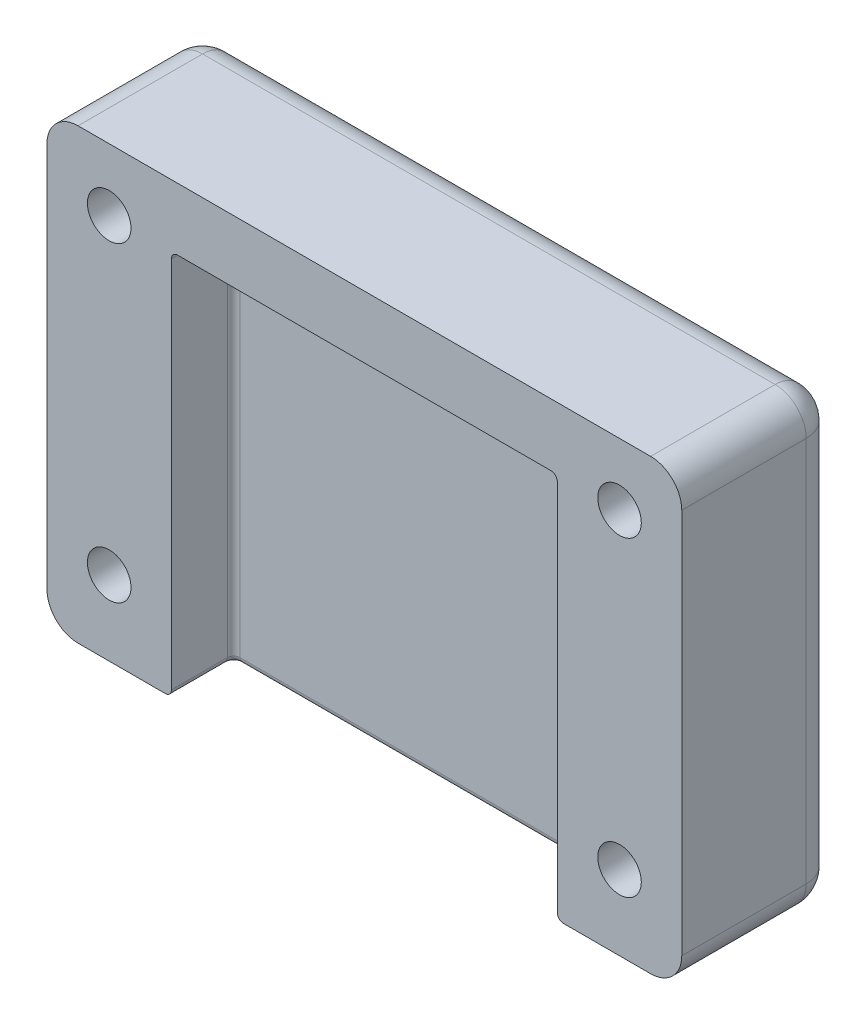
ISO-10303-21;
HEADER;
FILE_DESCRIPTION(('STEP AP214'),'2;1');
FILE_NAME('part.step','',(''),(''),'','','');
FILE_SCHEMA(('AUTOMOTIVE_DESIGN { 1 0 10303 214 1 1 1 1 }'));
ENDSEC;
DATA;
#1=APPLICATION_CONTEXT('core data for automotive mechanical design processes');
#2=APPLICATION_PROTOCOL_DEFINITION('international standard','automotive_design',2000,#1);
#3=PRODUCT_CONTEXT('',#1,'mechanical');
#4=PRODUCT('Part','Part','',(#3));
#5=PRODUCT_RELATED_PRODUCT_CATEGORY('part','',(#4));
#6=PRODUCT_DEFINITION_FORMATION('','',#4);
#7=PRODUCT_DEFINITION_CONTEXT('part definition',#1,'design');
#8=PRODUCT_DEFINITION('design','',#6,#7);
#9=PRODUCT_DEFINITION_SHAPE('','',#8);
#10=(LENGTH_UNIT() NAMED_UNIT(*) SI_UNIT(.MILLI.,.METRE.));
#11=(NAMED_UNIT(*) PLANE_ANGLE_UNIT() SI_UNIT($,.RADIAN.));
#12=(NAMED_UNIT(*) SI_UNIT($,.STERADIAN.) SOLID_ANGLE_UNIT());
#13=UNCERTAINTY_MEASURE_WITH_UNIT(LENGTH_MEASURE(1.E-05),#10,'distance_accuracy_value','');
#14=(GEOMETRIC_REPRESENTATION_CONTEXT(3) GLOBAL_UNCERTAINTY_ASSIGNED_CONTEXT((#13)) GLOBAL_UNIT_ASSIGNED_CONTEXT((#10,
#11,#12)) REPRESENTATION_CONTEXT('',''));
#15=CARTESIAN_POINT('',(0.,0.,0.));
#16=DIRECTION('',(0.,0.,1.));
#17=DIRECTION('',(1.,0.,0.));
#18=AXIS2_PLACEMENT_3D('',#15,#16,#17);
#19=CARTESIAN_POINT('',(0.,36.,12.5));
#20=DIRECTION('',(1.,0.,0.));
#21=DIRECTION('',(0.,0.,-1.));
#22=AXIS2_PLACEMENT_3D('',#19,#20,#21);
#23=PLANE('',#22);
#24=DIRECTION('',(0.,-1.,0.));
#25=VECTOR('',#24,1.);
#26=CARTESIAN_POINT('',(0.,36.,12.5));
#27=LINE('',#26,#25);
#28=CARTESIAN_POINT('',(0.,33.5,12.5));
#29=VERTEX_POINT('',#28);
#30=CARTESIAN_POINT('',(0.,2.5,12.5));
#31=VERTEX_POINT('',#30);
#32=EDGE_CURVE('E525',#29,#31,#27,.T.);
#33=ORIENTED_EDGE('',*,*,#32,.F.);
#34=DIRECTION('',(0.,0.,-1.));
#35=VECTOR('',#34,1.);
#36=CARTESIAN_POINT('',(0.,33.5,12.5));
#37=LINE('',#36,#35);
#38=CARTESIAN_POINT('',(0.,33.5,2.5));
#39=VERTEX_POINT('',#38);
#40=EDGE_CURVE('E343',#29,#39,#37,.T.);
#41=ORIENTED_EDGE('',*,*,#40,.T.);
#42=DIRECTION('',(0.,-1.,0.));
#43=VECTOR('',#42,1.);
#44=CARTESIAN_POINT('',(0.,36.,2.5));
#45=LINE('',#44,#43);
#46=CARTESIAN_POINT('',(0.,2.5,2.5));
#47=VERTEX_POINT('',#46);
#48=EDGE_CURVE('E340',#39,#47,#45,.T.);
#49=ORIENTED_EDGE('',*,*,#48,.T.);
#50=DIRECTION('',(0.,0.,-1.));
#51=VECTOR('',#50,1.);
#52=CARTESIAN_POINT('',(0.,2.5,12.5));
#53=LINE('',#52,#51);
#54=EDGE_CURVE('E337',#47,#31,#53,.F.);
#55=ORIENTED_EDGE('',*,*,#54,.T.);
#56=EDGE_LOOP('',(#33,#41,#49,#55));
#57=FACE_BOUND('',#56,.T.);
#58=ADVANCED_FACE('F40',(#57),#23,.F.);
#59=CARTESIAN_POINT('',(0.,0.,12.5));
#60=DIRECTION('',(0.,1.,0.));
#61=DIRECTION('',(0.,0.,1.));
#62=AXIS2_PLACEMENT_3D('',#59,#60,#61);
#63=PLANE('',#62);
#64=DIRECTION('',(1.,0.,0.));
#65=VECTOR('',#64,1.);
#66=CARTESIAN_POINT('',(0.,0.,2.5));
#67=LINE('',#66,#65);
#68=CARTESIAN_POINT('',(2.5,0.,2.5));
#69=VERTEX_POINT('',#68);
#70=CARTESIAN_POINT('',(48.5,0.,2.5));
#71=VERTEX_POINT('',#70);
#72=EDGE_CURVE('E318',#69,#71,#67,.T.);
#73=ORIENTED_EDGE('',*,*,#72,.T.);
#74=DIRECTION('',(0.,0.,-1.));
#75=VECTOR('',#74,1.);
#76=CARTESIAN_POINT('',(48.5,0.,12.5));
#77=LINE('',#76,#75);
#78=CARTESIAN_POINT('',(48.5,0.,12.5));
#79=VERTEX_POINT('',#78);
#80=EDGE_CURVE('E321',#71,#79,#77,.F.);
#81=ORIENTED_EDGE('',*,*,#80,.T.);
#82=DIRECTION('',(1.,0.,0.));
#83=VECTOR('',#82,1.);
#84=CARTESIAN_POINT('',(0.,0.,12.5));
#85=LINE('',#84,#83);
#86=CARTESIAN_POINT('',(41.5,0.,12.5));
#87=VERTEX_POINT('',#86);
#88=EDGE_CURVE('E197',#87,#79,#85,.T.);
#89=ORIENTED_EDGE('',*,*,#88,.F.);
#90=DIRECTION('',(0.,0.,1.));
#91=VECTOR('',#90,1.);
#92=CARTESIAN_POINT('',(41.5,0.,12.5));
#93=LINE('',#92,#91);
#94=CARTESIAN_POINT('',(41.5,0.,8.));
#95=VERTEX_POINT('',#94);
#96=EDGE_CURVE('E462',#87,#95,#93,.F.);
#97=ORIENTED_EDGE('',*,*,#96,.T.);
#98=CARTESIAN_POINT('',(40.5,0.,8.));
#99=DIRECTION('',(0.,1.,0.));
#100=DIRECTION('',(0.,0.,1.));
#101=AXIS2_PLACEMENT_3D('',#98,#99,#100);
#102=CIRCLE('',#101,1.);
#103=CARTESIAN_POINT('',(40.5,0.,7.));
#104=VERTEX_POINT('',#103);
#105=EDGE_CURVE('E455',#104,#95,#102,.F.);
#106=ORIENTED_EDGE('',*,*,#105,.F.);
#107=DIRECTION('',(1.,0.,0.));
#108=VECTOR('',#107,1.);
#109=CARTESIAN_POINT('',(0.,0.,7.));
#110=LINE('',#109,#108);
#111=CARTESIAN_POINT('',(10.5,0.,7.));
#112=VERTEX_POINT('',#111);
#113=EDGE_CURVE('E220',#104,#112,#110,.F.);
#114=ORIENTED_EDGE('',*,*,#113,.T.);
#115=CARTESIAN_POINT('',(10.5,0.,8.));
#116=DIRECTION('',(0.,1.,0.));
#117=DIRECTION('',(0.,0.,1.));
#118=AXIS2_PLACEMENT_3D('',#115,#116,#117);
#119=CIRCLE('',#118,1.);
#120=CARTESIAN_POINT('',(9.49999999999999,0.,8.));
#121=VERTEX_POINT('',#120);
#122=EDGE_CURVE('E213',#121,#112,#119,.F.);
#123=ORIENTED_EDGE('',*,*,#122,.F.);
#124=DIRECTION('',(0.,0.,1.));
#125=VECTOR('',#124,1.);
#126=CARTESIAN_POINT('',(9.49999999999999,0.,12.5));
#127=LINE('',#126,#125);
#128=CARTESIAN_POINT('',(9.49999999999999,0.,12.5));
#129=VERTEX_POINT('',#128);
#130=EDGE_CURVE('E204',#121,#129,#127,.T.);
#131=ORIENTED_EDGE('',*,*,#130,.T.);
#132=CARTESIAN_POINT('',(2.5,0.,12.5));
#133=VERTEX_POINT('',#132);
#134=EDGE_CURVE('E182',#133,#129,#85,.T.);
#135=ORIENTED_EDGE('',*,*,#134,.F.);
#136=DIRECTION('',(0.,0.,-1.));
#137=VECTOR('',#136,1.);
#138=CARTESIAN_POINT('',(2.5,0.,12.5));
#139=LINE('',#138,#137);
#140=EDGE_CURVE('E268',#133,#69,#139,.T.);
#141=ORIENTED_EDGE('',*,*,#140,.T.);
#142=EDGE_LOOP('',(#73,#81,#89,#97,#106,#114,#123,#131,#135,#141));
#143=FACE_BOUND('',#142,.T.);
#144=ADVANCED_FACE('F211',(#143),#63,.F.);
#145=CARTESIAN_POINT('',(51.,0.,12.5));
#146=DIRECTION('',(-1.,0.,0.));
#147=DIRECTION('',(0.,0.,1.));
#148=AXIS2_PLACEMENT_3D('',#145,#146,#147);
#149=PLANE('',#148);
#150=DIRECTION('',(0.,1.,0.));
#151=VECTOR('',#150,1.);
#152=CARTESIAN_POINT('',(51.,0.,2.5));
#153=LINE('',#152,#151);
#154=CARTESIAN_POINT('',(51.,2.5,2.5));
#155=VERTEX_POINT('',#154);
#156=CARTESIAN_POINT('',(51.,33.5,2.5));
#157=VERTEX_POINT('',#156);
#158=EDGE_CURVE('E50',#155,#157,#153,.T.);
#159=ORIENTED_EDGE('',*,*,#158,.T.);
#160=DIRECTION('',(0.,0.,-1.));
#161=VECTOR('',#160,1.);
#162=CARTESIAN_POINT('',(51.,33.5,12.5));
#163=LINE('',#162,#161);
#164=CARTESIAN_POINT('',(51.,33.5,12.5));
#165=VERTEX_POINT('',#164);
#166=EDGE_CURVE('E11',#157,#165,#163,.F.);
#167=ORIENTED_EDGE('',*,*,#166,.T.);
#168=DIRECTION('',(0.,1.,0.));
#169=VECTOR('',#168,1.);
#170=CARTESIAN_POINT('',(51.,0.,12.5));
#171=LINE('',#170,#169);
#172=CARTESIAN_POINT('',(51.,2.5,12.5));
#173=VERTEX_POINT('',#172);
#174=EDGE_CURVE('E196',#173,#165,#171,.T.);
#175=ORIENTED_EDGE('',*,*,#174,.F.);
#176=DIRECTION('',(0.,0.,-1.));
#177=VECTOR('',#176,1.);
#178=CARTESIAN_POINT('',(51.,2.5,12.5));
#179=LINE('',#178,#177);
#180=EDGE_CURVE('E61',#173,#155,#179,.T.);
#181=ORIENTED_EDGE('',*,*,#180,.T.);
#182=EDGE_LOOP('',(#159,#167,#175,#181));
#183=FACE_BOUND('',#182,.T.);
#184=ADVANCED_FACE('F450',(#183),#149,.F.);
#185=CARTESIAN_POINT('',(51.,36.,12.5));
#186=DIRECTION('',(0.,-1.,0.));
#187=DIRECTION('',(0.,0.,-1.));
#188=AXIS2_PLACEMENT_3D('',#185,#186,#187);
#189=PLANE('',#188);
#190=DIRECTION('',(-1.,0.,0.));
#191=VECTOR('',#190,1.);
#192=CARTESIAN_POINT('',(51.,36.,2.5));
#193=LINE('',#192,#191);
#194=CARTESIAN_POINT('',(48.5,36.,2.5));
#195=VERTEX_POINT('',#194);
#196=CARTESIAN_POINT('',(2.5,36.,2.5));
#197=VERTEX_POINT('',#196);
#198=EDGE_CURVE('E346',#195,#197,#193,.T.);
#199=ORIENTED_EDGE('',*,*,#198,.T.);
#200=DIRECTION('',(0.,0.,-1.));
#201=VECTOR('',#200,1.);
#202=CARTESIAN_POINT('',(2.5,36.,12.5));
#203=LINE('',#202,#201);
#204=CARTESIAN_POINT('',(2.5,36.,12.5));
#205=VERTEX_POINT('',#204);
#206=EDGE_CURVE('E352',#197,#205,#203,.F.);
#207=ORIENTED_EDGE('',*,*,#206,.T.);
#208=DIRECTION('',(-1.,0.,0.));
#209=VECTOR('',#208,1.);
#210=CARTESIAN_POINT('',(51.,36.,12.5));
#211=LINE('',#210,#209);
#212=CARTESIAN_POINT('',(48.5,36.,12.5));
#213=VERTEX_POINT('',#212);
#214=EDGE_CURVE('E452',#213,#205,#211,.T.);
#215=ORIENTED_EDGE('',*,*,#214,.F.);
#216=DIRECTION('',(0.,0.,-1.));
#217=VECTOR('',#216,1.);
#218=CARTESIAN_POINT('',(48.5,36.,12.5));
#219=LINE('',#218,#217);
#220=EDGE_CURVE('E349',#213,#195,#219,.T.);
#221=ORIENTED_EDGE('',*,*,#220,.T.);
#222=EDGE_LOOP('',(#199,#207,#215,#221));
#223=FACE_BOUND('',#222,.T.);
#224=ADVANCED_FACE('F581',(#223),#189,.F.);
#225=CARTESIAN_POINT('',(0.,0.,12.5));
#226=DIRECTION('',(0.,0.,1.));
#227=DIRECTION('',(1.,0.,0.));
#228=AXIS2_PLACEMENT_3D('',#225,#226,#227);
#229=PLANE('',#228);
#230=CARTESIAN_POINT('',(5.,5.99999999999999,12.5));
#231=DIRECTION('',(0.,0.,1.));
#232=DIRECTION('',(1.,0.,0.));
#233=AXIS2_PLACEMENT_3D('',#230,#231,#232);
#234=CIRCLE('',#233,1.75);
#235=CARTESIAN_POINT('',(6.75,5.99999999999999,12.5));
#236=VERTEX_POINT('',#235);
#237=EDGE_CURVE('E554',#236,#236,#234,.T.);
#238=ORIENTED_EDGE('',*,*,#237,.F.);
#239=EDGE_LOOP('',(#238));
#240=FACE_BOUND('',#239,.T.);
#241=CARTESIAN_POINT('',(46.,31.,12.5));
#242=DIRECTION('',(0.,0.,1.));
#243=DIRECTION('',(1.,0.,0.));
#244=AXIS2_PLACEMENT_3D('',#241,#242,#243);
#245=CIRCLE('',#244,1.75);
#246=CARTESIAN_POINT('',(47.75,31.,12.5));
#247=VERTEX_POINT('',#246);
#248=EDGE_CURVE('E545',#247,#247,#245,.T.);
#249=ORIENTED_EDGE('',*,*,#248,.F.);
#250=EDGE_LOOP('',(#249));
#251=FACE_BOUND('',#250,.T.);
#252=CARTESIAN_POINT('',(46.,5.99999999999999,12.5));
#253=DIRECTION('',(0.,0.,1.));
#254=DIRECTION('',(1.,0.,0.));
#255=AXIS2_PLACEMENT_3D('',#252,#253,#254);
#256=CIRCLE('',#255,1.75);
#257=CARTESIAN_POINT('',(47.75,5.99999999999999,12.5));
#258=VERTEX_POINT('',#257);
#259=EDGE_CURVE('E315',#258,#258,#256,.T.);
#260=ORIENTED_EDGE('',*,*,#259,.F.);
#261=EDGE_LOOP('',(#260));
#262=FACE_BOUND('',#261,.T.);
#263=CARTESIAN_POINT('',(5.,31.,12.5));
#264=DIRECTION('',(0.,0.,1.));
#265=DIRECTION('',(1.,0.,0.));
#266=AXIS2_PLACEMENT_3D('',#263,#264,#265);
#267=CIRCLE('',#266,1.75);
#268=CARTESIAN_POINT('',(6.75,31.,12.5));
#269=VERTEX_POINT('',#268);
#270=EDGE_CURVE('E537',#269,#269,#267,.T.);
#271=ORIENTED_EDGE('',*,*,#270,.F.);
#272=EDGE_LOOP('',(#271));
#273=FACE_BOUND('',#272,.T.);
#274=ORIENTED_EDGE('',*,*,#214,.T.);
#275=CARTESIAN_POINT('',(2.5,33.5,12.5));
#276=DIRECTION('',(0.,0.,1.));
#277=DIRECTION('',(1.,0.,0.));
#278=AXIS2_PLACEMENT_3D('',#275,#276,#277);
#279=CIRCLE('',#278,2.5);
#280=EDGE_CURVE('E363',#205,#29,#279,.T.);
#281=ORIENTED_EDGE('',*,*,#280,.T.);
#282=ORIENTED_EDGE('',*,*,#32,.T.);
#283=CARTESIAN_POINT('',(2.5,2.5,12.5));
#284=DIRECTION('',(0.,0.,1.));
#285=DIRECTION('',(1.,0.,0.));
#286=AXIS2_PLACEMENT_3D('',#283,#284,#285);
#287=CIRCLE('',#286,2.5);
#288=EDGE_CURVE('E191',#31,#133,#287,.T.);
#289=ORIENTED_EDGE('',*,*,#288,.T.);
#290=ORIENTED_EDGE('',*,*,#134,.T.);
#291=CARTESIAN_POINT('',(9.49999999999999,0.5,12.5));
#292=DIRECTION('',(0.,0.,1.));
#293=DIRECTION('',(1.,0.,0.));
#294=AXIS2_PLACEMENT_3D('',#291,#292,#293);
#295=CIRCLE('',#294,0.5);
#296=CARTESIAN_POINT('',(9.99999999999999,0.5,12.5));
#297=VERTEX_POINT('',#296);
#298=EDGE_CURVE('E187',#129,#297,#295,.T.);
#299=ORIENTED_EDGE('',*,*,#298,.T.);
#300=DIRECTION('',(0.,-1.,0.));
#301=VECTOR('',#300,1.);
#302=CARTESIAN_POINT('',(9.99999999999999,0.,12.5));
#303=LINE('',#302,#301);
#304=CARTESIAN_POINT('',(9.99999999999999,30.5,12.5));
#305=VERTEX_POINT('',#304);
#306=EDGE_CURVE('E527',#305,#297,#303,.T.);
#307=ORIENTED_EDGE('',*,*,#306,.F.);
#308=CARTESIAN_POINT('',(10.5,30.5,12.5));
#309=DIRECTION('',(0.,0.,1.));
#310=DIRECTION('',(1.,0.,0.));
#311=AXIS2_PLACEMENT_3D('',#308,#309,#310);
#312=CIRCLE('',#311,0.5);
#313=CARTESIAN_POINT('',(10.5,31.,12.5));
#314=VERTEX_POINT('',#313);
#315=EDGE_CURVE('E265',#305,#314,#312,.F.);
#316=ORIENTED_EDGE('',*,*,#315,.T.);
#317=DIRECTION('',(-1.,0.,0.));
#318=VECTOR('',#317,1.);
#319=CARTESIAN_POINT('',(9.99999999999999,31.,12.5));
#320=LINE('',#319,#318);
#321=CARTESIAN_POINT('',(40.5,31.,12.5));
#322=VERTEX_POINT('',#321);
#323=EDGE_CURVE('E529',#322,#314,#320,.T.);
#324=ORIENTED_EDGE('',*,*,#323,.F.);
#325=CARTESIAN_POINT('',(40.5,30.5,12.5));
#326=DIRECTION('',(0.,0.,1.));
#327=DIRECTION('',(1.,0.,0.));
#328=AXIS2_PLACEMENT_3D('',#325,#326,#327);
#329=CIRCLE('',#328,0.5);
#330=CARTESIAN_POINT('',(41.,30.5,12.5));
#331=VERTEX_POINT('',#330);
#332=EDGE_CURVE('E262',#322,#331,#329,.F.);
#333=ORIENTED_EDGE('',*,*,#332,.T.);
#334=DIRECTION('',(0.,1.,0.));
#335=VECTOR('',#334,1.);
#336=CARTESIAN_POINT('',(41.,31.,12.5));
#337=LINE('',#336,#335);
#338=CARTESIAN_POINT('',(41.,0.5,12.5));
#339=VERTEX_POINT('',#338);
#340=EDGE_CURVE('E523',#339,#331,#337,.T.);
#341=ORIENTED_EDGE('',*,*,#340,.F.);
#342=CARTESIAN_POINT('',(41.5,0.5,12.5));
#343=DIRECTION('',(0.,0.,1.));
#344=DIRECTION('',(1.,0.,0.));
#345=AXIS2_PLACEMENT_3D('',#342,#343,#344);
#346=CIRCLE('',#345,0.5);
#347=EDGE_CURVE('E208',#339,#87,#346,.T.);
#348=ORIENTED_EDGE('',*,*,#347,.T.);
#349=ORIENTED_EDGE('',*,*,#88,.T.);
#350=CARTESIAN_POINT('',(48.5,2.5,12.5));
#351=DIRECTION('',(0.,0.,1.));
#352=DIRECTION('',(1.,0.,0.));
#353=AXIS2_PLACEMENT_3D('',#350,#351,#352);
#354=CIRCLE('',#353,2.5);
#355=EDGE_CURVE('E357',#79,#173,#354,.T.);
#356=ORIENTED_EDGE('',*,*,#355,.T.);
#357=ORIENTED_EDGE('',*,*,#174,.T.);
#358=CARTESIAN_POINT('',(48.5,33.5,12.5));
#359=DIRECTION('',(0.,0.,1.));
#360=DIRECTION('',(1.,0.,0.));
#361=AXIS2_PLACEMENT_3D('',#358,#359,#360);
#362=CIRCLE('',#361,2.5);
#363=EDGE_CURVE('E360',#165,#213,#362,.T.);
#364=ORIENTED_EDGE('',*,*,#363,.T.);
#365=EDGE_LOOP('',(#274,#281,#282,#289,#290,#299,#307,#316,#324,#333,#341,#348,#349,#356,#357,#364));
#366=FACE_BOUND('',#365,.T.);
#367=ADVANCED_FACE('F185',(#240,#251,#262,#273,#366),#229,.T.);
#368=CARTESIAN_POINT('',(0.,0.,0.));
#369=DIRECTION('',(0.,0.,1.));
#370=DIRECTION('',(1.,0.,0.));
#371=AXIS2_PLACEMENT_3D('',#368,#369,#370);
#372=PLANE('',#371);
#373=DIRECTION('',(0.,1.,0.));
#374=VECTOR('',#373,1.);
#375=CARTESIAN_POINT('',(48.5,0.,0.));
#376=LINE('',#375,#374);
#377=CARTESIAN_POINT('',(48.5,33.5,0.));
#378=VERTEX_POINT('',#377);
#379=CARTESIAN_POINT('',(48.5,2.5,0.));
#380=VERTEX_POINT('',#379);
#381=EDGE_CURVE('E324',#378,#380,#376,.F.);
#382=ORIENTED_EDGE('',*,*,#381,.T.);
#383=DIRECTION('',(1.,0.,0.));
#384=VECTOR('',#383,1.);
#385=CARTESIAN_POINT('',(0.,2.5,0.));
#386=LINE('',#385,#384);
#387=CARTESIAN_POINT('',(2.5,2.5,0.));
#388=VERTEX_POINT('',#387);
#389=EDGE_CURVE('E333',#380,#388,#386,.F.);
#390=ORIENTED_EDGE('',*,*,#389,.T.);
#391=DIRECTION('',(0.,-1.,0.));
#392=VECTOR('',#391,1.);
#393=CARTESIAN_POINT('',(2.5,0.,0.));
#394=LINE('',#393,#392);
#395=CARTESIAN_POINT('',(2.5,33.5,0.));
#396=VERTEX_POINT('',#395);
#397=EDGE_CURVE('E330',#388,#396,#394,.F.);
#398=ORIENTED_EDGE('',*,*,#397,.T.);
#399=DIRECTION('',(-1.,0.,0.));
#400=VECTOR('',#399,1.);
#401=CARTESIAN_POINT('',(0.,33.5,0.));
#402=LINE('',#401,#400);
#403=EDGE_CURVE('E327',#396,#378,#402,.F.);
#404=ORIENTED_EDGE('',*,*,#403,.T.);
#405=EDGE_LOOP('',(#382,#390,#398,#404));
#406=FACE_BOUND('',#405,.T.);
#407=CARTESIAN_POINT('',(5.,5.99999999999999,0.));
#408=DIRECTION('',(0.,0.,1.));
#409=DIRECTION('',(1.,0.,0.));
#410=AXIS2_PLACEMENT_3D('',#407,#408,#409);
#411=CIRCLE('',#410,1.75);
#412=CARTESIAN_POINT('',(6.75,5.99999999999999,0.));
#413=VERTEX_POINT('',#412);
#414=EDGE_CURVE('E541',#413,#413,#411,.T.);
#415=ORIENTED_EDGE('',*,*,#414,.T.);
#416=EDGE_LOOP('',(#415));
#417=FACE_BOUND('',#416,.T.);
#418=CARTESIAN_POINT('',(46.,31.,0.));
#419=DIRECTION('',(0.,0.,1.));
#420=DIRECTION('',(1.,0.,0.));
#421=AXIS2_PLACEMENT_3D('',#418,#419,#420);
#422=CIRCLE('',#421,1.75);
#423=CARTESIAN_POINT('',(47.75,31.,0.));
#424=VERTEX_POINT('',#423);
#425=EDGE_CURVE('E549',#424,#424,#422,.T.);
#426=ORIENTED_EDGE('',*,*,#425,.T.);
#427=EDGE_LOOP('',(#426));
#428=FACE_BOUND('',#427,.T.);
#429=CARTESIAN_POINT('',(46.,5.99999999999999,0.));
#430=DIRECTION('',(0.,0.,1.));
#431=DIRECTION('',(1.,0.,0.));
#432=AXIS2_PLACEMENT_3D('',#429,#430,#431);
#433=CIRCLE('',#432,1.75);
#434=CARTESIAN_POINT('',(47.75,5.99999999999999,0.));
#435=VERTEX_POINT('',#434);
#436=EDGE_CURVE('E550',#435,#435,#433,.T.);
#437=ORIENTED_EDGE('',*,*,#436,.T.);
#438=EDGE_LOOP('',(#437));
#439=FACE_BOUND('',#438,.T.);
#440=CARTESIAN_POINT('',(5.,31.,0.));
#441=DIRECTION('',(0.,0.,1.));
#442=DIRECTION('',(1.,0.,0.));
#443=AXIS2_PLACEMENT_3D('',#440,#441,#442);
#444=CIRCLE('',#443,1.75);
#445=CARTESIAN_POINT('',(6.75,31.,0.));
#446=VERTEX_POINT('',#445);
#447=EDGE_CURVE('E536',#446,#446,#444,.T.);
#448=ORIENTED_EDGE('',*,*,#447,.T.);
#449=EDGE_LOOP('',(#448));
#450=FACE_BOUND('',#449,.T.);
#451=ADVANCED_FACE('F568',(#406,#417,#428,#439,#450),#372,.F.);
#452=CARTESIAN_POINT('',(9.99999999999999,0.,7.5));
#453=DIRECTION('',(-1.,0.,0.));
#454=DIRECTION('',(0.,-1.,0.));
#455=AXIS2_PLACEMENT_3D('',#452,#453,#454);
#456=PLANE('',#455);
#457=ORIENTED_EDGE('',*,*,#306,.T.);
#458=DIRECTION('',(0.,0.,1.));
#459=VECTOR('',#458,1.);
#460=CARTESIAN_POINT('',(9.99999999999999,0.5,7.5));
#461=LINE('',#460,#459);
#462=CARTESIAN_POINT('',(9.99999999999999,0.5,8.));
#463=VERTEX_POINT('',#462);
#464=EDGE_CURVE('E205',#297,#463,#461,.F.);
#465=ORIENTED_EDGE('',*,*,#464,.T.);
#466=DIRECTION('',(0.,-1.,0.));
#467=VECTOR('',#466,1.);
#468=CARTESIAN_POINT('',(9.99999999999999,31.,8.));
#469=LINE('',#468,#467);
#470=CARTESIAN_POINT('',(9.99999999999999,30.5,8.));
#471=VERTEX_POINT('',#470);
#472=EDGE_CURVE('E207',#463,#471,#469,.F.);
#473=ORIENTED_EDGE('',*,*,#472,.T.);
#474=DIRECTION('',(0.,0.,1.));
#475=VECTOR('',#474,1.);
#476=CARTESIAN_POINT('',(9.99999999999999,30.5,12.5));
#477=LINE('',#476,#475);
#478=EDGE_CURVE('E226',#471,#305,#477,.T.);
#479=ORIENTED_EDGE('',*,*,#478,.T.);
#480=EDGE_LOOP('',(#457,#465,#473,#479));
#481=FACE_BOUND('',#480,.T.);
#482=ADVANCED_FACE('F481',(#481),#456,.F.);
#483=CARTESIAN_POINT('',(9.99999999999999,31.,7.5));
#484=DIRECTION('',(0.,1.,0.));
#485=DIRECTION('',(0.,0.,1.));
#486=AXIS2_PLACEMENT_3D('',#483,#484,#485);
#487=PLANE('',#486);
#488=DIRECTION('',(-1.,0.,0.));
#489=VECTOR('',#488,1.);
#490=CARTESIAN_POINT('',(41.,31.,8.));
#491=LINE('',#490,#489);
#492=CARTESIAN_POINT('',(10.5,31.,8.));
#493=VERTEX_POINT('',#492);
#494=CARTESIAN_POINT('',(40.5,31.,8.));
#495=VERTEX_POINT('',#494);
#496=EDGE_CURVE('E253',#493,#495,#491,.F.);
#497=ORIENTED_EDGE('',*,*,#496,.T.);
#498=DIRECTION('',(0.,0.,1.));
#499=VECTOR('',#498,1.);
#500=CARTESIAN_POINT('',(40.5,31.,12.5));
#501=LINE('',#500,#499);
#502=EDGE_CURVE('E259',#495,#322,#501,.T.);
#503=ORIENTED_EDGE('',*,*,#502,.T.);
#504=ORIENTED_EDGE('',*,*,#323,.T.);
#505=DIRECTION('',(0.,0.,1.));
#506=VECTOR('',#505,1.);
#507=CARTESIAN_POINT('',(10.5,31.,7.5));
#508=LINE('',#507,#506);
#509=EDGE_CURVE('E256',#314,#493,#508,.F.);
#510=ORIENTED_EDGE('',*,*,#509,.T.);
#511=EDGE_LOOP('',(#497,#503,#504,#510));
#512=FACE_BOUND('',#511,.T.);
#513=ADVANCED_FACE('F497',(#512),#487,.F.);
#514=CARTESIAN_POINT('',(41.,31.,7.5));
#515=DIRECTION('',(1.,0.,0.));
#516=DIRECTION('',(0.,0.,-1.));
#517=AXIS2_PLACEMENT_3D('',#514,#515,#516);
#518=PLANE('',#517);
#519=DIRECTION('',(0.,1.,0.));
#520=VECTOR('',#519,1.);
#521=CARTESIAN_POINT('',(41.,0.,8.));
#522=LINE('',#521,#520);
#523=CARTESIAN_POINT('',(41.,30.5,8.));
#524=VERTEX_POINT('',#523);
#525=CARTESIAN_POINT('',(41.,0.5,8.));
#526=VERTEX_POINT('',#525);
#527=EDGE_CURVE('E244',#524,#526,#522,.F.);
#528=ORIENTED_EDGE('',*,*,#527,.T.);
#529=DIRECTION('',(0.,0.,1.));
#530=VECTOR('',#529,1.);
#531=CARTESIAN_POINT('',(41.,0.5,7.5));
#532=LINE('',#531,#530);
#533=EDGE_CURVE('E250',#526,#339,#532,.T.);
#534=ORIENTED_EDGE('',*,*,#533,.T.);
#535=ORIENTED_EDGE('',*,*,#340,.T.);
#536=DIRECTION('',(0.,0.,1.));
#537=VECTOR('',#536,1.);
#538=CARTESIAN_POINT('',(41.,30.5,7.5));
#539=LINE('',#538,#537);
#540=EDGE_CURVE('E247',#331,#524,#539,.F.);
#541=ORIENTED_EDGE('',*,*,#540,.T.);
#542=EDGE_LOOP('',(#528,#534,#535,#541));
#543=FACE_BOUND('',#542,.T.);
#544=ADVANCED_FACE('F515',(#543),#518,.F.);
#545=CARTESIAN_POINT('',(0.,0.,7.5));
#546=DIRECTION('',(0.,0.,-1.));
#547=DIRECTION('',(-1.,0.,0.));
#548=AXIS2_PLACEMENT_3D('',#545,#546,#547);
#549=PLANE('',#548);
#550=DIRECTION('',(0.,-1.,0.));
#551=VECTOR('',#550,1.);
#552=CARTESIAN_POINT('',(10.5,0.,7.5));
#553=LINE('',#552,#551);
#554=CARTESIAN_POINT('',(10.5,30.5,7.5));
#555=VERTEX_POINT('',#554);
#556=CARTESIAN_POINT('',(10.5,0.5,7.5));
#557=VERTEX_POINT('',#556);
#558=EDGE_CURVE('E237',#555,#557,#553,.T.);
#559=ORIENTED_EDGE('',*,*,#558,.T.);
#560=DIRECTION('',(1.,0.,0.));
#561=VECTOR('',#560,1.);
#562=CARTESIAN_POINT('',(0.,0.5,7.5));
#563=LINE('',#562,#561);
#564=CARTESIAN_POINT('',(40.5,0.5,7.5));
#565=VERTEX_POINT('',#564);
#566=EDGE_CURVE('E240',#557,#565,#563,.T.);
#567=ORIENTED_EDGE('',*,*,#566,.T.);
#568=DIRECTION('',(0.,1.,0.));
#569=VECTOR('',#568,1.);
#570=CARTESIAN_POINT('',(40.5,31.,7.5));
#571=LINE('',#570,#569);
#572=CARTESIAN_POINT('',(40.5,30.5,7.5));
#573=VERTEX_POINT('',#572);
#574=EDGE_CURVE('E234',#565,#573,#571,.T.);
#575=ORIENTED_EDGE('',*,*,#574,.T.);
#576=DIRECTION('',(-1.,0.,0.));
#577=VECTOR('',#576,1.);
#578=CARTESIAN_POINT('',(9.99999999999999,30.5,7.5));
#579=LINE('',#578,#577);
#580=EDGE_CURVE('E231',#573,#555,#579,.T.);
#581=ORIENTED_EDGE('',*,*,#580,.T.);
#582=EDGE_LOOP('',(#559,#567,#575,#581));
#583=FACE_BOUND('',#582,.T.);
#584=ADVANCED_FACE('F587',(#583),#549,.F.);
#585=CARTESIAN_POINT('',(5.,31.,0.));
#586=DIRECTION('',(0.,0.,1.));
#587=DIRECTION('',(1.,0.,0.));
#588=AXIS2_PLACEMENT_3D('',#585,#586,#587);
#589=CYLINDRICAL_SURFACE('',#588,1.75);
#590=ORIENTED_EDGE('',*,*,#447,.F.);
#591=EDGE_LOOP('',(#590));
#592=FACE_BOUND('',#591,.T.);
#593=ORIENTED_EDGE('',*,*,#270,.T.);
#594=EDGE_LOOP('',(#593));
#595=FACE_BOUND('',#594,.T.);
#596=ADVANCED_FACE('F575',(#592,#595),#589,.F.);
#597=CARTESIAN_POINT('',(46.,5.99999999999999,0.));
#598=DIRECTION('',(0.,0.,1.));
#599=DIRECTION('',(1.,0.,0.));
#600=AXIS2_PLACEMENT_3D('',#597,#598,#599);
#601=CYLINDRICAL_SURFACE('',#600,1.75);
#602=ORIENTED_EDGE('',*,*,#436,.F.);
#603=EDGE_LOOP('',(#602));
#604=FACE_BOUND('',#603,.T.);
#605=ORIENTED_EDGE('',*,*,#259,.T.);
#606=EDGE_LOOP('',(#605));
#607=FACE_BOUND('',#606,.T.);
#608=ADVANCED_FACE('F571',(#604,#607),#601,.F.);
#609=CARTESIAN_POINT('',(46.,31.,0.));
#610=DIRECTION('',(0.,0.,1.));
#611=DIRECTION('',(1.,0.,0.));
#612=AXIS2_PLACEMENT_3D('',#609,#610,#611);
#613=CYLINDRICAL_SURFACE('',#612,1.75);
#614=ORIENTED_EDGE('',*,*,#425,.F.);
#615=EDGE_LOOP('',(#614));
#616=FACE_BOUND('',#615,.T.);
#617=ORIENTED_EDGE('',*,*,#248,.T.);
#618=EDGE_LOOP('',(#617));
#619=FACE_BOUND('',#618,.T.);
#620=ADVANCED_FACE('F574',(#616,#619),#613,.F.);
#621=CARTESIAN_POINT('',(5.,5.99999999999999,0.));
#622=DIRECTION('',(0.,0.,1.));
#623=DIRECTION('',(1.,0.,0.));
#624=AXIS2_PLACEMENT_3D('',#621,#622,#623);
#625=CYLINDRICAL_SURFACE('',#624,1.75);
#626=ORIENTED_EDGE('',*,*,#414,.F.);
#627=EDGE_LOOP('',(#626));
#628=FACE_BOUND('',#627,.T.);
#629=ORIENTED_EDGE('',*,*,#237,.T.);
#630=EDGE_LOOP('',(#629));
#631=FACE_BOUND('',#630,.T.);
#632=ADVANCED_FACE('F631',(#628,#631),#625,.F.);
#633=CARTESIAN_POINT('',(40.5,30.5,7.5));
#634=DIRECTION('',(0.,0.,-1.));
#635=DIRECTION('',(-1.,0.,0.));
#636=AXIS2_PLACEMENT_3D('',#633,#634,#635);
#637=CYLINDRICAL_SURFACE('',#636,0.5);
#638=CARTESIAN_POINT('',(40.5,30.5,8.));
#639=DIRECTION('',(0.,0.,1.));
#640=DIRECTION('',(1.,0.,0.));
#641=AXIS2_PLACEMENT_3D('',#638,#639,#640);
#642=CIRCLE('',#641,0.5);
#643=EDGE_CURVE('E311',#524,#495,#642,.T.);
#644=ORIENTED_EDGE('',*,*,#643,.F.);
#645=ORIENTED_EDGE('',*,*,#540,.F.);
#646=ORIENTED_EDGE('',*,*,#332,.F.);
#647=ORIENTED_EDGE('',*,*,#502,.F.);
#648=EDGE_LOOP('',(#644,#645,#646,#647));
#649=FACE_BOUND('',#648,.T.);
#650=ADVANCED_FACE('F503',(#649),#637,.F.);
#651=CARTESIAN_POINT('',(40.5,30.5,8.));
#652=DIRECTION('',(0.,1.,0.));
#653=DIRECTION('',(0.,0.,1.));
#654=AXIS2_PLACEMENT_3D('',#651,#652,#653);
#655=SPHERICAL_SURFACE('',#654,0.5);
#656=CARTESIAN_POINT('',(40.5,30.5,8.));
#657=DIRECTION('',(0.,-1.,0.));
#658=DIRECTION('',(0.,0.,-1.));
#659=AXIS2_PLACEMENT_3D('',#656,#657,#658);
#660=CIRCLE('',#659,0.5);
#661=EDGE_CURVE('E303',#524,#573,#660,.F.);
#662=ORIENTED_EDGE('',*,*,#661,.F.);
#663=ORIENTED_EDGE('',*,*,#643,.T.);
#664=CARTESIAN_POINT('',(40.5,30.5,8.));
#665=DIRECTION('',(-1.,0.,0.));
#666=DIRECTION('',(0.,0.,1.));
#667=AXIS2_PLACEMENT_3D('',#664,#665,#666);
#668=CIRCLE('',#667,0.5);
#669=EDGE_CURVE('E307',#573,#495,#668,.F.);
#670=ORIENTED_EDGE('',*,*,#669,.F.);
#671=EDGE_LOOP('',(#662,#663,#670));
#672=FACE_BOUND('',#671,.T.);
#673=ADVANCED_FACE('F507',(#672),#655,.F.);
#674=CARTESIAN_POINT('',(10.5,30.5,7.5));
#675=DIRECTION('',(0.,0.,-1.));
#676=DIRECTION('',(-1.,0.,0.));
#677=AXIS2_PLACEMENT_3D('',#674,#675,#676);
#678=CYLINDRICAL_SURFACE('',#677,0.5);
#679=ORIENTED_EDGE('',*,*,#315,.F.);
#680=ORIENTED_EDGE('',*,*,#478,.F.);
#681=CARTESIAN_POINT('',(10.5,30.5,8.));
#682=DIRECTION('',(0.,0.,1.));
#683=DIRECTION('',(1.,0.,0.));
#684=AXIS2_PLACEMENT_3D('',#681,#682,#683);
#685=CIRCLE('',#684,0.5);
#686=EDGE_CURVE('E299',#493,#471,#685,.T.);
#687=ORIENTED_EDGE('',*,*,#686,.F.);
#688=ORIENTED_EDGE('',*,*,#509,.F.);
#689=EDGE_LOOP('',(#679,#680,#687,#688));
#690=FACE_BOUND('',#689,.T.);
#691=ADVANCED_FACE('F485',(#690),#678,.F.);
#692=CARTESIAN_POINT('',(0.,30.5,8.));
#693=DIRECTION('',(1.,0.,0.));
#694=DIRECTION('',(0.,0.,-1.));
#695=AXIS2_PLACEMENT_3D('',#692,#693,#694);
#696=CYLINDRICAL_SURFACE('',#695,0.5);
#697=ORIENTED_EDGE('',*,*,#669,.T.);
#698=ORIENTED_EDGE('',*,*,#496,.F.);
#699=CARTESIAN_POINT('',(10.5,30.5,8.));
#700=DIRECTION('',(1.,0.,0.));
#701=DIRECTION('',(0.,0.,-1.));
#702=AXIS2_PLACEMENT_3D('',#699,#700,#701);
#703=CIRCLE('',#702,0.5);
#704=EDGE_CURVE('E295',#555,#493,#703,.T.);
#705=ORIENTED_EDGE('',*,*,#704,.F.);
#706=ORIENTED_EDGE('',*,*,#580,.F.);
#707=EDGE_LOOP('',(#697,#698,#705,#706));
#708=FACE_BOUND('',#707,.T.);
#709=ADVANCED_FACE('F493',(#708),#696,.F.);
#710=CARTESIAN_POINT('',(40.5,0.,8.));
#711=DIRECTION('',(0.,-1.,0.));
#712=DIRECTION('',(0.,0.,-1.));
#713=AXIS2_PLACEMENT_3D('',#710,#711,#712);
#714=CYLINDRICAL_SURFACE('',#713,0.5);
#715=ORIENTED_EDGE('',*,*,#661,.T.);
#716=ORIENTED_EDGE('',*,*,#574,.F.);
#717=CARTESIAN_POINT('',(40.5,0.5,8.));
#718=DIRECTION('',(0.,1.,0.));
#719=DIRECTION('',(0.,0.,1.));
#720=AXIS2_PLACEMENT_3D('',#717,#718,#719);
#721=CIRCLE('',#720,0.5);
#722=EDGE_CURVE('E291',#526,#565,#721,.T.);
#723=ORIENTED_EDGE('',*,*,#722,.F.);
#724=ORIENTED_EDGE('',*,*,#527,.F.);
#725=EDGE_LOOP('',(#715,#716,#723,#724));
#726=FACE_BOUND('',#725,.T.);
#727=ADVANCED_FACE('F512',(#726),#714,.F.);
#728=CARTESIAN_POINT('',(41.5,0.5,7.5));
#729=DIRECTION('',(0.,0.,1.));
#730=DIRECTION('',(1.,0.,0.));
#731=AXIS2_PLACEMENT_3D('',#728,#729,#730);
#732=CYLINDRICAL_SURFACE('',#731,0.5);
#733=ORIENTED_EDGE('',*,*,#347,.F.);
#734=ORIENTED_EDGE('',*,*,#533,.F.);
#735=CARTESIAN_POINT('',(41.5,0.5,8.));
#736=DIRECTION('',(0.,0.,-1.));
#737=DIRECTION('',(-1.,0.,0.));
#738=AXIS2_PLACEMENT_3D('',#735,#736,#737);
#739=CIRCLE('',#738,0.5);
#740=EDGE_CURVE('E287',#95,#526,#739,.T.);
#741=ORIENTED_EDGE('',*,*,#740,.F.);
#742=ORIENTED_EDGE('',*,*,#96,.F.);
#743=EDGE_LOOP('',(#733,#734,#741,#742));
#744=FACE_BOUND('',#743,.T.);
#745=ADVANCED_FACE('F521',(#744),#732,.T.);
#746=CARTESIAN_POINT('',(10.5,30.5,8.));
#747=DIRECTION('',(0.,1.,0.));
#748=DIRECTION('',(0.,0.,1.));
#749=AXIS2_PLACEMENT_3D('',#746,#747,#748);
#750=SPHERICAL_SURFACE('',#749,0.5);
#751=ORIENTED_EDGE('',*,*,#704,.T.);
#752=ORIENTED_EDGE('',*,*,#686,.T.);
#753=CARTESIAN_POINT('',(10.5,30.5,8.));
#754=DIRECTION('',(0.,-1.,0.));
#755=DIRECTION('',(0.,0.,-1.));
#756=AXIS2_PLACEMENT_3D('',#753,#754,#755);
#757=CIRCLE('',#756,0.5);
#758=EDGE_CURVE('E283',#555,#471,#757,.F.);
#759=ORIENTED_EDGE('',*,*,#758,.F.);
#760=EDGE_LOOP('',(#751,#752,#759));
#761=FACE_BOUND('',#760,.T.);
#762=ADVANCED_FACE('F488',(#761),#750,.F.);
#763=CARTESIAN_POINT('',(40.5,0.5,8.));
#764=DIRECTION('',(0.,1.,0.));
#765=DIRECTION('',(0.,0.,1.));
#766=AXIS2_PLACEMENT_3D('',#763,#764,#765);
#767=TOROIDAL_SURFACE('',#766,1.,0.5);
#768=ORIENTED_EDGE('',*,*,#740,.T.);
#769=ORIENTED_EDGE('',*,*,#722,.T.);
#770=CARTESIAN_POINT('',(40.5,0.5,7.));
#771=DIRECTION('',(1.,0.,0.));
#772=DIRECTION('',(0.,0.,-1.));
#773=AXIS2_PLACEMENT_3D('',#770,#771,#772);
#774=CIRCLE('',#773,0.5);
#775=EDGE_CURVE('E280',#104,#565,#774,.F.);
#776=ORIENTED_EDGE('',*,*,#775,.F.);
#777=ORIENTED_EDGE('',*,*,#105,.T.);
#778=EDGE_LOOP('',(#768,#769,#776,#777));
#779=FACE_BOUND('',#778,.T.);
#780=ADVANCED_FACE('F613',(#779),#767,.T.);
#781=CARTESIAN_POINT('',(10.5,0.,8.));
#782=DIRECTION('',(0.,1.,0.));
#783=DIRECTION('',(-1.,0.,0.));
#784=AXIS2_PLACEMENT_3D('',#781,#782,#783);
#785=CYLINDRICAL_SURFACE('',#784,0.5);
#786=ORIENTED_EDGE('',*,*,#758,.T.);
#787=ORIENTED_EDGE('',*,*,#472,.F.);
#788=CARTESIAN_POINT('',(10.5,0.5,8.));
#789=DIRECTION('',(0.,1.,0.));
#790=DIRECTION('',(0.,0.,1.));
#791=AXIS2_PLACEMENT_3D('',#788,#789,#790);
#792=CIRCLE('',#791,0.5);
#793=EDGE_CURVE('E276',#557,#463,#792,.T.);
#794=ORIENTED_EDGE('',*,*,#793,.F.);
#795=ORIENTED_EDGE('',*,*,#558,.F.);
#796=EDGE_LOOP('',(#786,#787,#794,#795));
#797=FACE_BOUND('',#796,.T.);
#798=ADVANCED_FACE('F477',(#797),#785,.F.);
#799=CARTESIAN_POINT('',(0.,0.5,7.));
#800=DIRECTION('',(1.,0.,0.));
#801=DIRECTION('',(0.,0.,-1.));
#802=AXIS2_PLACEMENT_3D('',#799,#800,#801);
#803=CYLINDRICAL_SURFACE('',#802,0.5);
#804=ORIENTED_EDGE('',*,*,#775,.T.);
#805=ORIENTED_EDGE('',*,*,#566,.F.);
#806=CARTESIAN_POINT('',(10.5,0.5,7.));
#807=DIRECTION('',(-1.,0.,0.));
#808=DIRECTION('',(0.,0.,1.));
#809=AXIS2_PLACEMENT_3D('',#806,#807,#808);
#810=CIRCLE('',#809,0.5);
#811=EDGE_CURVE('E272',#112,#557,#810,.T.);
#812=ORIENTED_EDGE('',*,*,#811,.F.);
#813=ORIENTED_EDGE('',*,*,#113,.F.);
#814=EDGE_LOOP('',(#804,#805,#812,#813));
#815=FACE_BOUND('',#814,.T.);
#816=ADVANCED_FACE('F470',(#815),#803,.T.);
#817=CARTESIAN_POINT('',(10.5,0.5,8.));
#818=DIRECTION('',(0.,1.,0.));
#819=DIRECTION('',(0.,0.,1.));
#820=AXIS2_PLACEMENT_3D('',#817,#818,#819);
#821=TOROIDAL_SURFACE('',#820,1.,0.5);
#822=ORIENTED_EDGE('',*,*,#811,.T.);
#823=ORIENTED_EDGE('',*,*,#793,.T.);
#824=CARTESIAN_POINT('',(9.49999999999999,0.5,8.));
#825=DIRECTION('',(0.,0.,-1.));
#826=DIRECTION('',(-1.,0.,0.));
#827=AXIS2_PLACEMENT_3D('',#824,#825,#826);
#828=CIRCLE('',#827,0.5);
#829=EDGE_CURVE('E269',#121,#463,#828,.F.);
#830=ORIENTED_EDGE('',*,*,#829,.F.);
#831=ORIENTED_EDGE('',*,*,#122,.T.);
#832=EDGE_LOOP('',(#822,#823,#830,#831));
#833=FACE_BOUND('',#832,.T.);
#834=ADVANCED_FACE('F473',(#833),#821,.T.);
#835=CARTESIAN_POINT('',(9.49999999999999,0.5,12.5));
#836=DIRECTION('',(0.,0.,1.));
#837=DIRECTION('',(1.,0.,0.));
#838=AXIS2_PLACEMENT_3D('',#835,#836,#837);
#839=CYLINDRICAL_SURFACE('',#838,0.5);
#840=ORIENTED_EDGE('',*,*,#829,.T.);
#841=ORIENTED_EDGE('',*,*,#464,.F.);
#842=ORIENTED_EDGE('',*,*,#298,.F.);
#843=ORIENTED_EDGE('',*,*,#130,.F.);
#844=EDGE_LOOP('',(#840,#841,#842,#843));
#845=FACE_BOUND('',#844,.T.);
#846=ADVANCED_FACE('F203',(#845),#839,.T.);
#847=CARTESIAN_POINT('',(2.5,33.5,12.5));
#848=DIRECTION('',(0.,0.,-1.));
#849=DIRECTION('',(-1.,0.,0.));
#850=AXIS2_PLACEMENT_3D('',#847,#848,#849);
#851=CYLINDRICAL_SURFACE('',#850,2.5);
#852=ORIENTED_EDGE('',*,*,#280,.F.);
#853=ORIENTED_EDGE('',*,*,#206,.F.);
#854=CARTESIAN_POINT('',(2.5,33.5,2.5));
#855=DIRECTION('',(0.,0.,-1.));
#856=DIRECTION('',(-1.,0.,0.));
#857=AXIS2_PLACEMENT_3D('',#854,#855,#856);
#858=CIRCLE('',#857,2.5);
#859=EDGE_CURVE('E407',#39,#197,#858,.T.);
#860=ORIENTED_EDGE('',*,*,#859,.F.);
#861=ORIENTED_EDGE('',*,*,#40,.F.);
#862=EDGE_LOOP('',(#852,#853,#860,#861));
#863=FACE_BOUND('',#862,.T.);
#864=ADVANCED_FACE('F42',(#863),#851,.T.);
#865=CARTESIAN_POINT('',(48.5,33.5,12.5));
#866=DIRECTION('',(0.,0.,-1.));
#867=DIRECTION('',(-1.,0.,0.));
#868=AXIS2_PLACEMENT_3D('',#865,#866,#867);
#869=CYLINDRICAL_SURFACE('',#868,2.5);
#870=ORIENTED_EDGE('',*,*,#363,.F.);
#871=ORIENTED_EDGE('',*,*,#166,.F.);
#872=CARTESIAN_POINT('',(48.5,33.5,2.5));
#873=DIRECTION('',(0.,0.,-1.));
#874=DIRECTION('',(-1.,0.,0.));
#875=AXIS2_PLACEMENT_3D('',#872,#873,#874);
#876=CIRCLE('',#875,2.5);
#877=EDGE_CURVE('E404',#195,#157,#876,.T.);
#878=ORIENTED_EDGE('',*,*,#877,.F.);
#879=ORIENTED_EDGE('',*,*,#220,.F.);
#880=EDGE_LOOP('',(#870,#871,#878,#879));
#881=FACE_BOUND('',#880,.T.);
#882=ADVANCED_FACE('F658',(#881),#869,.T.);
#883=CARTESIAN_POINT('',(51.,33.5,2.5));
#884=DIRECTION('',(-1.,0.,0.));
#885=DIRECTION('',(0.,0.,1.));
#886=AXIS2_PLACEMENT_3D('',#883,#884,#885);
#887=CYLINDRICAL_SURFACE('',#886,2.5);
#888=CARTESIAN_POINT('',(2.5,33.5,2.5));
#889=DIRECTION('',(-1.,0.,0.));
#890=DIRECTION('',(0.,0.,1.));
#891=AXIS2_PLACEMENT_3D('',#888,#889,#890);
#892=CIRCLE('',#891,2.5);
#893=EDGE_CURVE('E44',#197,#396,#892,.T.);
#894=ORIENTED_EDGE('',*,*,#893,.F.);
#895=ORIENTED_EDGE('',*,*,#198,.F.);
#896=CARTESIAN_POINT('',(48.5,33.5,2.5));
#897=DIRECTION('',(1.,0.,0.));
#898=DIRECTION('',(0.,0.,-1.));
#899=AXIS2_PLACEMENT_3D('',#896,#897,#898);
#900=CIRCLE('',#899,2.5);
#901=EDGE_CURVE('E400',#378,#195,#900,.T.);
#902=ORIENTED_EDGE('',*,*,#901,.F.);
#903=ORIENTED_EDGE('',*,*,#403,.F.);
#904=EDGE_LOOP('',(#894,#895,#902,#903));
#905=FACE_BOUND('',#904,.T.);
#906=ADVANCED_FACE('F656',(#905),#887,.T.);
#907=CARTESIAN_POINT('',(2.5,33.5,2.5));
#908=DIRECTION('',(0.,1.,0.));
#909=DIRECTION('',(0.,0.,1.));
#910=AXIS2_PLACEMENT_3D('',#907,#908,#909);
#911=SPHERICAL_SURFACE('',#910,2.5);
#912=ORIENTED_EDGE('',*,*,#859,.T.);
#913=ORIENTED_EDGE('',*,*,#893,.T.);
#914=CARTESIAN_POINT('',(2.5,33.5,2.5));
#915=DIRECTION('',(0.,1.,0.));
#916=DIRECTION('',(0.,0.,1.));
#917=AXIS2_PLACEMENT_3D('',#914,#915,#916);
#918=CIRCLE('',#917,2.5);
#919=EDGE_CURVE('E396',#39,#396,#918,.F.);
#920=ORIENTED_EDGE('',*,*,#919,.F.);
#921=EDGE_LOOP('',(#912,#913,#920));
#922=FACE_BOUND('',#921,.T.);
#923=ADVANCED_FACE('F416',(#922),#911,.T.);
#924=CARTESIAN_POINT('',(48.5,33.5,2.5));
#925=DIRECTION('',(0.,1.,0.));
#926=DIRECTION('',(0.,0.,1.));
#927=AXIS2_PLACEMENT_3D('',#924,#925,#926);
#928=SPHERICAL_SURFACE('',#927,2.5);
#929=ORIENTED_EDGE('',*,*,#901,.T.);
#930=ORIENTED_EDGE('',*,*,#877,.T.);
#931=CARTESIAN_POINT('',(48.5,33.5,2.5));
#932=DIRECTION('',(0.,1.,0.));
#933=DIRECTION('',(0.,0.,1.));
#934=AXIS2_PLACEMENT_3D('',#931,#932,#933);
#935=CIRCLE('',#934,2.5);
#936=EDGE_CURVE('E392',#378,#157,#935,.F.);
#937=ORIENTED_EDGE('',*,*,#936,.F.);
#938=EDGE_LOOP('',(#929,#930,#937));
#939=FACE_BOUND('',#938,.T.);
#940=ADVANCED_FACE('F650',(#939),#928,.T.);
#941=CARTESIAN_POINT('',(2.5,36.,2.5));
#942=DIRECTION('',(0.,-1.,0.));
#943=DIRECTION('',(0.,0.,-1.));
#944=AXIS2_PLACEMENT_3D('',#941,#942,#943);
#945=CYLINDRICAL_SURFACE('',#944,2.5);
#946=ORIENTED_EDGE('',*,*,#919,.T.);
#947=ORIENTED_EDGE('',*,*,#397,.F.);
#948=CARTESIAN_POINT('',(2.5,2.5,2.5));
#949=DIRECTION('',(0.,-1.,0.));
#950=DIRECTION('',(0.,0.,-1.));
#951=AXIS2_PLACEMENT_3D('',#948,#949,#950);
#952=CIRCLE('',#951,2.5);
#953=EDGE_CURVE('E388',#47,#388,#952,.T.);
#954=ORIENTED_EDGE('',*,*,#953,.F.);
#955=ORIENTED_EDGE('',*,*,#48,.F.);
#956=EDGE_LOOP('',(#946,#947,#954,#955));
#957=FACE_BOUND('',#956,.T.);
#958=ADVANCED_FACE('F423',(#957),#945,.T.);
#959=CARTESIAN_POINT('',(2.5,2.5,12.5));
#960=DIRECTION('',(0.,0.,-1.));
#961=DIRECTION('',(-1.,0.,0.));
#962=AXIS2_PLACEMENT_3D('',#959,#960,#961);
#963=CYLINDRICAL_SURFACE('',#962,2.5);
#964=ORIENTED_EDGE('',*,*,#288,.F.);
#965=ORIENTED_EDGE('',*,*,#54,.F.);
#966=CARTESIAN_POINT('',(2.5,2.5,2.5));
#967=DIRECTION('',(0.,0.,-1.));
#968=DIRECTION('',(-1.,0.,0.));
#969=AXIS2_PLACEMENT_3D('',#966,#967,#968);
#970=CIRCLE('',#969,2.5);
#971=EDGE_CURVE('E384',#69,#47,#970,.T.);
#972=ORIENTED_EDGE('',*,*,#971,.F.);
#973=ORIENTED_EDGE('',*,*,#140,.F.);
#974=EDGE_LOOP('',(#964,#965,#972,#973));
#975=FACE_BOUND('',#974,.T.);
#976=ADVANCED_FACE('F431',(#975),#963,.T.);
#977=CARTESIAN_POINT('',(48.5,2.5,12.5));
#978=DIRECTION('',(0.,0.,-1.));
#979=DIRECTION('',(-1.,0.,0.));
#980=AXIS2_PLACEMENT_3D('',#977,#978,#979);
#981=CYLINDRICAL_SURFACE('',#980,2.5);
#982=ORIENTED_EDGE('',*,*,#355,.F.);
#983=ORIENTED_EDGE('',*,*,#80,.F.);
#984=CARTESIAN_POINT('',(48.5,2.5,2.5));
#985=DIRECTION('',(0.,0.,-1.));
#986=DIRECTION('',(-1.,0.,0.));
#987=AXIS2_PLACEMENT_3D('',#984,#985,#986);
#988=CIRCLE('',#987,2.5);
#989=EDGE_CURVE('E380',#155,#71,#988,.T.);
#990=ORIENTED_EDGE('',*,*,#989,.F.);
#991=ORIENTED_EDGE('',*,*,#180,.F.);
#992=EDGE_LOOP('',(#982,#983,#990,#991));
#993=FACE_BOUND('',#992,.T.);
#994=ADVANCED_FACE('F447',(#993),#981,.T.);
#995=CARTESIAN_POINT('',(48.5,0.,2.5));
#996=DIRECTION('',(0.,1.,0.));
#997=DIRECTION('',(0.,0.,1.));
#998=AXIS2_PLACEMENT_3D('',#995,#996,#997);
#999=CYLINDRICAL_SURFACE('',#998,2.5);
#1000=ORIENTED_EDGE('',*,*,#936,.T.);
#1001=ORIENTED_EDGE('',*,*,#158,.F.);
#1002=CARTESIAN_POINT('',(48.5,2.5,2.5));
#1003=DIRECTION('',(0.,-1.,0.));
#1004=DIRECTION('',(0.,0.,-1.));
#1005=AXIS2_PLACEMENT_3D('',#1002,#1003,#1004);
#1006=CIRCLE('',#1005,2.5);
#1007=EDGE_CURVE('E376',#380,#155,#1006,.T.);
#1008=ORIENTED_EDGE('',*,*,#1007,.F.);
#1009=ORIENTED_EDGE('',*,*,#381,.F.);
#1010=EDGE_LOOP('',(#1000,#1001,#1008,#1009));
#1011=FACE_BOUND('',#1010,.T.);
#1012=ADVANCED_FACE('F639',(#1011),#999,.T.);
#1013=CARTESIAN_POINT('',(2.5,2.5,2.5));
#1014=DIRECTION('',(-1.,0.,0.));
#1015=DIRECTION('',(0.,0.,1.));
#1016=AXIS2_PLACEMENT_3D('',#1013,#1014,#1015);
#1017=SPHERICAL_SURFACE('',#1016,2.5);
#1018=ORIENTED_EDGE('',*,*,#971,.T.);
#1019=ORIENTED_EDGE('',*,*,#953,.T.);
#1020=CARTESIAN_POINT('',(2.5,2.5,2.5));
#1021=DIRECTION('',(-1.,0.,0.));
#1022=DIRECTION('',(0.,0.,1.));
#1023=AXIS2_PLACEMENT_3D('',#1020,#1021,#1022);
#1024=CIRCLE('',#1023,2.5);
#1025=EDGE_CURVE('E373',#69,#388,#1024,.F.);
#1026=ORIENTED_EDGE('',*,*,#1025,.F.);
#1027=EDGE_LOOP('',(#1018,#1019,#1026));
#1028=FACE_BOUND('',#1027,.T.);
#1029=ADVANCED_FACE('F636',(#1028),#1017,.T.);
#1030=CARTESIAN_POINT('',(48.5,2.5,2.5));
#1031=DIRECTION('',(1.,0.,0.));
#1032=DIRECTION('',(0.,0.,-1.));
#1033=AXIS2_PLACEMENT_3D('',#1030,#1031,#1032);
#1034=SPHERICAL_SURFACE('',#1033,2.5);
#1035=ORIENTED_EDGE('',*,*,#1007,.T.);
#1036=ORIENTED_EDGE('',*,*,#989,.T.);
#1037=CARTESIAN_POINT('',(48.5,2.5,2.5));
#1038=DIRECTION('',(1.,0.,0.));
#1039=DIRECTION('',(0.,0.,-1.));
#1040=AXIS2_PLACEMENT_3D('',#1037,#1038,#1039);
#1041=CIRCLE('',#1040,2.5);
#1042=EDGE_CURVE('E370',#380,#71,#1041,.F.);
#1043=ORIENTED_EDGE('',*,*,#1042,.F.);
#1044=EDGE_LOOP('',(#1035,#1036,#1043));
#1045=FACE_BOUND('',#1044,.T.);
#1046=ADVANCED_FACE('F443',(#1045),#1034,.T.);
#1047=CARTESIAN_POINT('',(0.,2.5,2.5));
#1048=DIRECTION('',(1.,0.,0.));
#1049=DIRECTION('',(0.,0.,-1.));
#1050=AXIS2_PLACEMENT_3D('',#1047,#1048,#1049);
#1051=CYLINDRICAL_SURFACE('',#1050,2.5);
#1052=ORIENTED_EDGE('',*,*,#1025,.T.);
#1053=ORIENTED_EDGE('',*,*,#389,.F.);
#1054=ORIENTED_EDGE('',*,*,#1042,.T.);
#1055=ORIENTED_EDGE('',*,*,#72,.F.);
#1056=EDGE_LOOP('',(#1052,#1053,#1054,#1055));
#1057=FACE_BOUND('',#1056,.T.);
#1058=ADVANCED_FACE('F438',(#1057),#1051,.T.);
#1059=CLOSED_SHELL('',(#58,#144,#184,#224,#367,#451,#482,#513,#544,#584,#596,#608,#620,#632,
#650,#673,#691,#709,#727,#745,#762,#780,#798,#816,#834,#846,#864,#882,#906,#923,#940,#958,#976,
#994,#1012,#1029,#1046,#1058));
#1060=MANIFOLD_SOLID_BREP('B2',#1059);
#1061=ADVANCED_BREP_SHAPE_REPRESENTATION('',(#18,#1060),#14);
#1062=SHAPE_DEFINITION_REPRESENTATION(#9,#1061);
ENDSEC;
END-ISO-10303-21;
